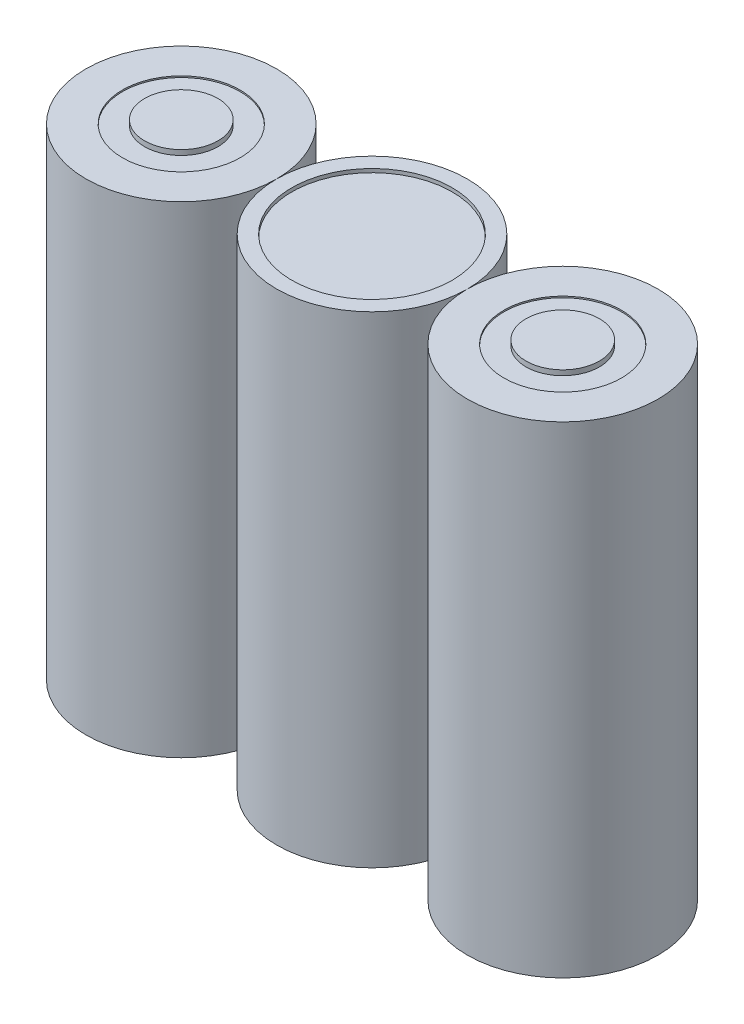
ISO-10303-21;
HEADER;
FILE_DESCRIPTION(('STEP AP214'),'2;1');
FILE_NAME('part.step','',(''),(''),'','','');
FILE_SCHEMA(('AUTOMOTIVE_DESIGN { 1 0 10303 214 1 1 1 1 }'));
ENDSEC;
DATA;
#1=APPLICATION_CONTEXT('core data for automotive mechanical design processes');
#2=APPLICATION_PROTOCOL_DEFINITION('international standard','automotive_design',2000,#1);
#3=PRODUCT_CONTEXT('',#1,'mechanical');
#4=PRODUCT('Part','Part','',(#3));
#5=PRODUCT_RELATED_PRODUCT_CATEGORY('part','',(#4));
#6=PRODUCT_DEFINITION_FORMATION('','',#4);
#7=PRODUCT_DEFINITION_CONTEXT('part definition',#1,'design');
#8=PRODUCT_DEFINITION('design','',#6,#7);
#9=PRODUCT_DEFINITION_SHAPE('','',#8);
#10=(LENGTH_UNIT() NAMED_UNIT(*) SI_UNIT(.MILLI.,.METRE.));
#11=(NAMED_UNIT(*) PLANE_ANGLE_UNIT() SI_UNIT($,.RADIAN.));
#12=(NAMED_UNIT(*) SI_UNIT($,.STERADIAN.) SOLID_ANGLE_UNIT());
#13=UNCERTAINTY_MEASURE_WITH_UNIT(LENGTH_MEASURE(1.E-05),#10,'distance_accuracy_value','');
#14=(GEOMETRIC_REPRESENTATION_CONTEXT(3) GLOBAL_UNCERTAINTY_ASSIGNED_CONTEXT((#13)) GLOBAL_UNIT_ASSIGNED_CONTEXT((#10,
#11,#12)) REPRESENTATION_CONTEXT('',''));
#15=CARTESIAN_POINT('',(0.,0.,0.));
#16=DIRECTION('',(0.,0.,1.));
#17=DIRECTION('',(1.,0.,0.));
#18=AXIS2_PLACEMENT_3D('',#15,#16,#17);
#19=CARTESIAN_POINT('',(0.,65.9,0.));
#20=DIRECTION('',(0.,-1.,0.));
#21=DIRECTION('',(0.,0.,-1.));
#22=AXIS2_PLACEMENT_3D('',#19,#20,#21);
#23=CYLINDRICAL_SURFACE('',#22,13.05);
#24=CARTESIAN_POINT('',(0.,65.9,0.));
#25=DIRECTION('',(0.,1.,0.));
#26=DIRECTION('',(0.,0.,1.));
#27=AXIS2_PLACEMENT_3D('',#24,#25,#26);
#28=CIRCLE('',#27,13.05);
#29=CARTESIAN_POINT('',(0.,65.9,13.05));
#30=VERTEX_POINT('',#29);
#31=EDGE_CURVE('P0_E10',#30,#30,#28,.T.);
#32=ORIENTED_EDGE('',*,*,#31,.F.);
#33=EDGE_LOOP('',(#32));
#34=FACE_BOUND('',#33,.T.);
#35=CARTESIAN_POINT('',(0.,0.,0.));
#36=DIRECTION('',(0.,1.,0.));
#37=DIRECTION('',(0.,0.,1.));
#38=AXIS2_PLACEMENT_3D('',#35,#36,#37);
#39=CIRCLE('',#38,13.05);
#40=CARTESIAN_POINT('',(0.,0.,13.05));
#41=VERTEX_POINT('',#40);
#42=EDGE_CURVE('P0_E18',#41,#41,#39,.T.);
#43=ORIENTED_EDGE('',*,*,#42,.T.);
#44=EDGE_LOOP('',(#43));
#45=FACE_BOUND('',#44,.T.);
#46=ADVANCED_FACE('P0_F15',(#34,#45),#23,.T.);
#47=CARTESIAN_POINT('',(0.,65.9,0.));
#48=DIRECTION('',(0.,1.,0.));
#49=DIRECTION('',(0.,0.,1.));
#50=AXIS2_PLACEMENT_3D('',#47,#48,#49);
#51=PLANE('',#50);
#52=CARTESIAN_POINT('',(0.,65.9,0.));
#53=DIRECTION('',(0.,1.,0.));
#54=DIRECTION('',(0.,0.,1.));
#55=AXIS2_PLACEMENT_3D('',#52,#53,#54);
#56=CIRCLE('',#55,8.04830878102376);
#57=CARTESIAN_POINT('',(0.,65.9,8.04830878102376));
#58=VERTEX_POINT('',#57);
#59=EDGE_CURVE('P0_E36',#58,#58,#56,.T.);
#60=ORIENTED_EDGE('',*,*,#59,.F.);
#61=EDGE_LOOP('',(#60));
#62=FACE_BOUND('',#61,.T.);
#63=ORIENTED_EDGE('',*,*,#31,.T.);
#64=EDGE_LOOP('',(#63));
#65=FACE_BOUND('',#64,.T.);
#66=ADVANCED_FACE('P0_F61',(#62,#65),#51,.T.);
#67=CARTESIAN_POINT('',(0.,0.,0.));
#68=DIRECTION('',(0.,1.,0.));
#69=DIRECTION('',(0.,0.,1.));
#70=AXIS2_PLACEMENT_3D('',#67,#68,#69);
#71=PLANE('',#70);
#72=CARTESIAN_POINT('',(0.,0.,0.));
#73=DIRECTION('',(0.,-1.,0.));
#74=DIRECTION('',(0.,0.,-1.));
#75=AXIS2_PLACEMENT_3D('',#72,#73,#74);
#76=CIRCLE('',#75,10.9781947014455);
#77=CARTESIAN_POINT('',(0.,0.,-10.9781947014455));
#78=VERTEX_POINT('',#77);
#79=EDGE_CURVE('P0_E27',#78,#78,#76,.T.);
#80=ORIENTED_EDGE('',*,*,#79,.F.);
#81=EDGE_LOOP('',(#80));
#82=FACE_BOUND('',#81,.T.);
#83=ORIENTED_EDGE('',*,*,#42,.F.);
#84=EDGE_LOOP('',(#83));
#85=FACE_BOUND('',#84,.T.);
#86=ADVANCED_FACE('P0_F63',(#82,#85),#71,.F.);
#87=CARTESIAN_POINT('',(0.,0.5,0.));
#88=DIRECTION('',(0.,-1.,0.));
#89=DIRECTION('',(0.,0.,-1.));
#90=AXIS2_PLACEMENT_3D('',#87,#88,#89);
#91=CYLINDRICAL_SURFACE('',#90,10.9781947014455);
#92=CARTESIAN_POINT('',(0.,0.5,0.));
#93=DIRECTION('',(0.,-1.,0.));
#94=DIRECTION('',(0.,0.,-1.));
#95=AXIS2_PLACEMENT_3D('',#92,#93,#94);
#96=CIRCLE('',#95,10.9781947014455);
#97=CARTESIAN_POINT('',(0.,0.5,-10.9781947014455));
#98=VERTEX_POINT('',#97);
#99=EDGE_CURVE('P0_E25',#98,#98,#96,.T.);
#100=ORIENTED_EDGE('',*,*,#99,.F.);
#101=EDGE_LOOP('',(#100));
#102=FACE_BOUND('',#101,.T.);
#103=ORIENTED_EDGE('',*,*,#79,.T.);
#104=EDGE_LOOP('',(#103));
#105=FACE_BOUND('',#104,.T.);
#106=ADVANCED_FACE('P0_F70',(#102,#105),#91,.F.);
#107=CARTESIAN_POINT('',(0.,0.5,0.));
#108=DIRECTION('',(0.,-1.,0.));
#109=DIRECTION('',(0.,0.,-1.));
#110=AXIS2_PLACEMENT_3D('',#107,#108,#109);
#111=PLANE('',#110);
#112=ORIENTED_EDGE('',*,*,#99,.T.);
#113=EDGE_LOOP('',(#112));
#114=FACE_BOUND('',#113,.T.);
#115=ADVANCED_FACE('P0_F57',(#114),#111,.T.);
#116=CARTESIAN_POINT('',(0.,65.7,0.));
#117=DIRECTION('',(0.,1.,0.));
#118=DIRECTION('',(0.,0.,1.));
#119=AXIS2_PLACEMENT_3D('',#116,#117,#118);
#120=CYLINDRICAL_SURFACE('',#119,8.04830878102376);
#121=CARTESIAN_POINT('',(0.,65.7,0.));
#122=DIRECTION('',(0.,1.,0.));
#123=DIRECTION('',(0.,0.,1.));
#124=AXIS2_PLACEMENT_3D('',#121,#122,#123);
#125=CIRCLE('',#124,8.04830878102376);
#126=CARTESIAN_POINT('',(0.,65.7,8.04830878102376));
#127=VERTEX_POINT('',#126);
#128=EDGE_CURVE('P0_E35',#127,#127,#125,.T.);
#129=ORIENTED_EDGE('',*,*,#128,.F.);
#130=EDGE_LOOP('',(#129));
#131=FACE_BOUND('',#130,.T.);
#132=ORIENTED_EDGE('',*,*,#59,.T.);
#133=EDGE_LOOP('',(#132));
#134=FACE_BOUND('',#133,.T.);
#135=ADVANCED_FACE('P0_F51',(#131,#134),#120,.F.);
#136=CARTESIAN_POINT('',(0.,65.7,0.));
#137=DIRECTION('',(0.,1.,0.));
#138=DIRECTION('',(0.,0.,1.));
#139=AXIS2_PLACEMENT_3D('',#136,#137,#138);
#140=PLANE('',#139);
#141=CARTESIAN_POINT('',(0.,65.7,0.));
#142=DIRECTION('',(0.,1.,0.));
#143=DIRECTION('',(0.,0.,1.));
#144=AXIS2_PLACEMENT_3D('',#141,#142,#143);
#145=CIRCLE('',#144,5.02170690928381);
#146=CARTESIAN_POINT('',(0.,65.7,5.02170690928381));
#147=VERTEX_POINT('',#146);
#148=EDGE_CURVE('P0_E39',#147,#147,#145,.T.);
#149=ORIENTED_EDGE('',*,*,#148,.F.);
#150=EDGE_LOOP('',(#149));
#151=FACE_BOUND('',#150,.T.);
#152=ORIENTED_EDGE('',*,*,#128,.T.);
#153=EDGE_LOOP('',(#152));
#154=FACE_BOUND('',#153,.T.);
#155=ADVANCED_FACE('P0_F47',(#151,#154),#140,.T.);
#156=CARTESIAN_POINT('',(0.,66.4,0.));
#157=DIRECTION('',(0.,1.,0.));
#158=DIRECTION('',(0.,0.,1.));
#159=AXIS2_PLACEMENT_3D('',#156,#157,#158);
#160=PLANE('',#159);
#161=CARTESIAN_POINT('',(0.,66.4,0.));
#162=DIRECTION('',(0.,1.,0.));
#163=DIRECTION('',(0.,0.,1.));
#164=AXIS2_PLACEMENT_3D('',#161,#162,#163);
#165=CIRCLE('',#164,5.02170690928381);
#166=CARTESIAN_POINT('',(0.,66.4,5.02170690928381));
#167=VERTEX_POINT('',#166);
#168=EDGE_CURVE('P0_E30',#167,#167,#165,.T.);
#169=ORIENTED_EDGE('',*,*,#168,.T.);
#170=EDGE_LOOP('',(#169));
#171=FACE_BOUND('',#170,.T.);
#172=ADVANCED_FACE('P0_F50',(#171),#160,.T.);
#173=CARTESIAN_POINT('',(0.,66.4,0.));
#174=DIRECTION('',(0.,-1.,0.));
#175=DIRECTION('',(0.,0.,-1.));
#176=AXIS2_PLACEMENT_3D('',#173,#174,#175);
#177=CYLINDRICAL_SURFACE('',#176,5.02170690928381);
#178=ORIENTED_EDGE('',*,*,#168,.F.);
#179=EDGE_LOOP('',(#178));
#180=FACE_BOUND('',#179,.T.);
#181=ORIENTED_EDGE('',*,*,#148,.T.);
#182=EDGE_LOOP('',(#181));
#183=FACE_BOUND('',#182,.T.);
#184=ADVANCED_FACE('P0_F45',(#180,#183),#177,.T.);
#185=CLOSED_SHELL('',(#46,#66,#86,#106,#115,#135,#155,#172,#184));
#186=MANIFOLD_SOLID_BREP('P0_B1',#185);
#187=CARTESIAN_POINT('',(26.1,0.,0.));
#188=DIRECTION('',(0.,1.,0.));
#189=DIRECTION('',(1.,0.,0.));
#190=AXIS2_PLACEMENT_3D('',#187,#188,#189);
#191=CYLINDRICAL_SURFACE('',#190,13.05);
#192=CARTESIAN_POINT('',(26.1,0.,0.));
#193=DIRECTION('',(0.,-1.,0.));
#194=DIRECTION('',(-1.,0.,0.));
#195=AXIS2_PLACEMENT_3D('',#192,#193,#194);
#196=CIRCLE('',#195,13.05);
#197=CARTESIAN_POINT('',(13.05,0.,0.));
#198=VERTEX_POINT('',#197);
#199=EDGE_CURVE('P1_E10',#198,#198,#196,.T.);
#200=ORIENTED_EDGE('',*,*,#199,.F.);
#201=EDGE_LOOP('',(#200));
#202=FACE_BOUND('',#201,.T.);
#203=CARTESIAN_POINT('',(26.1,65.9,0.));
#204=DIRECTION('',(0.,-1.,0.));
#205=DIRECTION('',(-1.,0.,0.));
#206=AXIS2_PLACEMENT_3D('',#203,#204,#205);
#207=CIRCLE('',#206,13.05);
#208=CARTESIAN_POINT('',(13.05,65.9,0.));
#209=VERTEX_POINT('',#208);
#210=EDGE_CURVE('P1_E18',#209,#209,#207,.T.);
#211=ORIENTED_EDGE('',*,*,#210,.T.);
#212=EDGE_LOOP('',(#211));
#213=FACE_BOUND('',#212,.T.);
#214=ADVANCED_FACE('P1_F15',(#202,#213),#191,.T.);
#215=CARTESIAN_POINT('',(26.1,0.,0.));
#216=DIRECTION('',(0.,-1.,0.));
#217=DIRECTION('',(-1.,0.,0.));
#218=AXIS2_PLACEMENT_3D('',#215,#216,#217);
#219=PLANE('',#218);
#220=CARTESIAN_POINT('',(26.1,0.,0.));
#221=DIRECTION('',(0.,-1.,0.));
#222=DIRECTION('',(-1.,0.,0.));
#223=AXIS2_PLACEMENT_3D('',#220,#221,#222);
#224=CIRCLE('',#223,8.04830878102376);
#225=CARTESIAN_POINT('',(18.0516912189762,0.,0.));
#226=VERTEX_POINT('',#225);
#227=EDGE_CURVE('P1_E36',#226,#226,#224,.T.);
#228=ORIENTED_EDGE('',*,*,#227,.F.);
#229=EDGE_LOOP('',(#228));
#230=FACE_BOUND('',#229,.T.);
#231=ORIENTED_EDGE('',*,*,#199,.T.);
#232=EDGE_LOOP('',(#231));
#233=FACE_BOUND('',#232,.T.);
#234=ADVANCED_FACE('P1_F61',(#230,#233),#219,.T.);
#235=CARTESIAN_POINT('',(26.1,65.9,0.));
#236=DIRECTION('',(0.,-1.,0.));
#237=DIRECTION('',(-1.,0.,0.));
#238=AXIS2_PLACEMENT_3D('',#235,#236,#237);
#239=PLANE('',#238);
#240=CARTESIAN_POINT('',(26.1,65.9,0.));
#241=DIRECTION('',(0.,1.,0.));
#242=DIRECTION('',(1.,0.,0.));
#243=AXIS2_PLACEMENT_3D('',#240,#241,#242);
#244=CIRCLE('',#243,10.9781947014455);
#245=CARTESIAN_POINT('',(37.0781947014455,65.9,0.));
#246=VERTEX_POINT('',#245);
#247=EDGE_CURVE('P1_E27',#246,#246,#244,.T.);
#248=ORIENTED_EDGE('',*,*,#247,.F.);
#249=EDGE_LOOP('',(#248));
#250=FACE_BOUND('',#249,.T.);
#251=ORIENTED_EDGE('',*,*,#210,.F.);
#252=EDGE_LOOP('',(#251));
#253=FACE_BOUND('',#252,.T.);
#254=ADVANCED_FACE('P1_F63',(#250,#253),#239,.F.);
#255=CARTESIAN_POINT('',(26.1,65.4,0.));
#256=DIRECTION('',(0.,1.,0.));
#257=DIRECTION('',(1.,0.,0.));
#258=AXIS2_PLACEMENT_3D('',#255,#256,#257);
#259=CYLINDRICAL_SURFACE('',#258,10.9781947014455);
#260=CARTESIAN_POINT('',(26.1,65.4,0.));
#261=DIRECTION('',(0.,1.,0.));
#262=DIRECTION('',(1.,0.,0.));
#263=AXIS2_PLACEMENT_3D('',#260,#261,#262);
#264=CIRCLE('',#263,10.9781947014455);
#265=CARTESIAN_POINT('',(37.0781947014455,65.4,0.));
#266=VERTEX_POINT('',#265);
#267=EDGE_CURVE('P1_E25',#266,#266,#264,.T.);
#268=ORIENTED_EDGE('',*,*,#267,.F.);
#269=EDGE_LOOP('',(#268));
#270=FACE_BOUND('',#269,.T.);
#271=ORIENTED_EDGE('',*,*,#247,.T.);
#272=EDGE_LOOP('',(#271));
#273=FACE_BOUND('',#272,.T.);
#274=ADVANCED_FACE('P1_F70',(#270,#273),#259,.F.);
#275=CARTESIAN_POINT('',(26.1,65.4,0.));
#276=DIRECTION('',(0.,1.,0.));
#277=DIRECTION('',(1.,0.,0.));
#278=AXIS2_PLACEMENT_3D('',#275,#276,#277);
#279=PLANE('',#278);
#280=ORIENTED_EDGE('',*,*,#267,.T.);
#281=EDGE_LOOP('',(#280));
#282=FACE_BOUND('',#281,.T.);
#283=ADVANCED_FACE('P1_F57',(#282),#279,.T.);
#284=CARTESIAN_POINT('',(26.1,0.200000000000006,0.));
#285=DIRECTION('',(0.,-1.,0.));
#286=DIRECTION('',(-1.,0.,0.));
#287=AXIS2_PLACEMENT_3D('',#284,#285,#286);
#288=CYLINDRICAL_SURFACE('',#287,8.04830878102376);
#289=CARTESIAN_POINT('',(26.1,0.200000000000006,0.));
#290=DIRECTION('',(0.,-1.,0.));
#291=DIRECTION('',(-1.,0.,0.));
#292=AXIS2_PLACEMENT_3D('',#289,#290,#291);
#293=CIRCLE('',#292,8.04830878102376);
#294=CARTESIAN_POINT('',(18.0516912189762,0.200000000000006,0.));
#295=VERTEX_POINT('',#294);
#296=EDGE_CURVE('P1_E35',#295,#295,#293,.T.);
#297=ORIENTED_EDGE('',*,*,#296,.F.);
#298=EDGE_LOOP('',(#297));
#299=FACE_BOUND('',#298,.T.);
#300=ORIENTED_EDGE('',*,*,#227,.T.);
#301=EDGE_LOOP('',(#300));
#302=FACE_BOUND('',#301,.T.);
#303=ADVANCED_FACE('P1_F51',(#299,#302),#288,.F.);
#304=CARTESIAN_POINT('',(26.1,0.200000000000006,0.));
#305=DIRECTION('',(0.,-1.,0.));
#306=DIRECTION('',(-1.,0.,0.));
#307=AXIS2_PLACEMENT_3D('',#304,#305,#306);
#308=PLANE('',#307);
#309=CARTESIAN_POINT('',(26.1,0.200000000000006,0.));
#310=DIRECTION('',(0.,-1.,0.));
#311=DIRECTION('',(-1.,0.,0.));
#312=AXIS2_PLACEMENT_3D('',#309,#310,#311);
#313=CIRCLE('',#312,5.02170690928381);
#314=CARTESIAN_POINT('',(21.0782930907162,0.200000000000006,0.));
#315=VERTEX_POINT('',#314);
#316=EDGE_CURVE('P1_E39',#315,#315,#313,.T.);
#317=ORIENTED_EDGE('',*,*,#316,.F.);
#318=EDGE_LOOP('',(#317));
#319=FACE_BOUND('',#318,.T.);
#320=ORIENTED_EDGE('',*,*,#296,.T.);
#321=EDGE_LOOP('',(#320));
#322=FACE_BOUND('',#321,.T.);
#323=ADVANCED_FACE('P1_F47',(#319,#322),#308,.T.);
#324=CARTESIAN_POINT('',(26.1,-0.5,0.));
#325=DIRECTION('',(0.,-1.,0.));
#326=DIRECTION('',(-1.,0.,0.));
#327=AXIS2_PLACEMENT_3D('',#324,#325,#326);
#328=PLANE('',#327);
#329=CARTESIAN_POINT('',(26.1,-0.5,0.));
#330=DIRECTION('',(0.,-1.,0.));
#331=DIRECTION('',(-1.,0.,0.));
#332=AXIS2_PLACEMENT_3D('',#329,#330,#331);
#333=CIRCLE('',#332,5.02170690928381);
#334=CARTESIAN_POINT('',(21.0782930907162,-0.5,0.));
#335=VERTEX_POINT('',#334);
#336=EDGE_CURVE('P1_E30',#335,#335,#333,.T.);
#337=ORIENTED_EDGE('',*,*,#336,.T.);
#338=EDGE_LOOP('',(#337));
#339=FACE_BOUND('',#338,.T.);
#340=ADVANCED_FACE('P1_F50',(#339),#328,.T.);
#341=CARTESIAN_POINT('',(26.1,-0.5,0.));
#342=DIRECTION('',(0.,1.,0.));
#343=DIRECTION('',(1.,0.,0.));
#344=AXIS2_PLACEMENT_3D('',#341,#342,#343);
#345=CYLINDRICAL_SURFACE('',#344,5.02170690928381);
#346=ORIENTED_EDGE('',*,*,#336,.F.);
#347=EDGE_LOOP('',(#346));
#348=FACE_BOUND('',#347,.T.);
#349=ORIENTED_EDGE('',*,*,#316,.T.);
#350=EDGE_LOOP('',(#349));
#351=FACE_BOUND('',#350,.T.);
#352=ADVANCED_FACE('P1_F45',(#348,#351),#345,.T.);
#353=CLOSED_SHELL('',(#214,#234,#254,#274,#283,#303,#323,#340,#352));
#354=MANIFOLD_SOLID_BREP('P1_B1',#353);
#355=CARTESIAN_POINT('',(52.2,65.9,0.));
#356=DIRECTION('',(0.,-1.,0.));
#357=DIRECTION('',(0.,0.,-1.));
#358=AXIS2_PLACEMENT_3D('',#355,#356,#357);
#359=CYLINDRICAL_SURFACE('',#358,13.05);
#360=CARTESIAN_POINT('',(52.2,65.9,0.));
#361=DIRECTION('',(0.,1.,0.));
#362=DIRECTION('',(0.,0.,1.));
#363=AXIS2_PLACEMENT_3D('',#360,#361,#362);
#364=CIRCLE('',#363,13.05);
#365=CARTESIAN_POINT('',(52.2,65.9,13.05));
#366=VERTEX_POINT('',#365);
#367=EDGE_CURVE('P2_E9',#366,#366,#364,.T.);
#368=ORIENTED_EDGE('',*,*,#367,.F.);
#369=EDGE_LOOP('',(#368));
#370=FACE_BOUND('',#369,.T.);
#371=CARTESIAN_POINT('',(52.2,0.,0.));
#372=DIRECTION('',(0.,1.,0.));
#373=DIRECTION('',(0.,0.,1.));
#374=AXIS2_PLACEMENT_3D('',#371,#372,#373);
#375=CIRCLE('',#374,13.05);
#376=CARTESIAN_POINT('',(52.2,0.,13.05));
#377=VERTEX_POINT('',#376);
#378=EDGE_CURVE('P2_E17',#377,#377,#375,.T.);
#379=ORIENTED_EDGE('',*,*,#378,.T.);
#380=EDGE_LOOP('',(#379));
#381=FACE_BOUND('',#380,.T.);
#382=ADVANCED_FACE('P2_F14',(#370,#381),#359,.T.);
#383=CARTESIAN_POINT('',(52.2,65.9,0.));
#384=DIRECTION('',(0.,1.,0.));
#385=DIRECTION('',(0.,0.,1.));
#386=AXIS2_PLACEMENT_3D('',#383,#384,#385);
#387=PLANE('',#386);
#388=CARTESIAN_POINT('',(52.2,65.9,0.));
#389=DIRECTION('',(0.,1.,0.));
#390=DIRECTION('',(0.,0.,1.));
#391=AXIS2_PLACEMENT_3D('',#388,#389,#390);
#392=CIRCLE('',#391,8.04830878102376);
#393=CARTESIAN_POINT('',(52.2,65.9,8.04830878102376));
#394=VERTEX_POINT('',#393);
#395=EDGE_CURVE('P2_E35',#394,#394,#392,.T.);
#396=ORIENTED_EDGE('',*,*,#395,.F.);
#397=EDGE_LOOP('',(#396));
#398=FACE_BOUND('',#397,.T.);
#399=ORIENTED_EDGE('',*,*,#367,.T.);
#400=EDGE_LOOP('',(#399));
#401=FACE_BOUND('',#400,.T.);
#402=ADVANCED_FACE('P2_F60',(#398,#401),#387,.T.);
#403=CARTESIAN_POINT('',(52.2,0.,0.));
#404=DIRECTION('',(0.,1.,0.));
#405=DIRECTION('',(0.,0.,1.));
#406=AXIS2_PLACEMENT_3D('',#403,#404,#405);
#407=PLANE('',#406);
#408=CARTESIAN_POINT('',(52.2,0.,0.));
#409=DIRECTION('',(0.,-1.,0.));
#410=DIRECTION('',(0.,0.,-1.));
#411=AXIS2_PLACEMENT_3D('',#408,#409,#410);
#412=CIRCLE('',#411,10.9781947014455);
#413=CARTESIAN_POINT('',(52.2,0.,-10.9781947014455));
#414=VERTEX_POINT('',#413);
#415=EDGE_CURVE('P2_E26',#414,#414,#412,.T.);
#416=ORIENTED_EDGE('',*,*,#415,.F.);
#417=EDGE_LOOP('',(#416));
#418=FACE_BOUND('',#417,.T.);
#419=ORIENTED_EDGE('',*,*,#378,.F.);
#420=EDGE_LOOP('',(#419));
#421=FACE_BOUND('',#420,.T.);
#422=ADVANCED_FACE('P2_F62',(#418,#421),#407,.F.);
#423=CARTESIAN_POINT('',(52.2,0.5,0.));
#424=DIRECTION('',(0.,-1.,0.));
#425=DIRECTION('',(0.,0.,-1.));
#426=AXIS2_PLACEMENT_3D('',#423,#424,#425);
#427=CYLINDRICAL_SURFACE('',#426,10.9781947014455);
#428=CARTESIAN_POINT('',(52.2,0.5,0.));
#429=DIRECTION('',(0.,-1.,0.));
#430=DIRECTION('',(0.,0.,-1.));
#431=AXIS2_PLACEMENT_3D('',#428,#429,#430);
#432=CIRCLE('',#431,10.9781947014455);
#433=CARTESIAN_POINT('',(52.2,0.5,-10.9781947014455));
#434=VERTEX_POINT('',#433);
#435=EDGE_CURVE('P2_E24',#434,#434,#432,.T.);
#436=ORIENTED_EDGE('',*,*,#435,.F.);
#437=EDGE_LOOP('',(#436));
#438=FACE_BOUND('',#437,.T.);
#439=ORIENTED_EDGE('',*,*,#415,.T.);
#440=EDGE_LOOP('',(#439));
#441=FACE_BOUND('',#440,.T.);
#442=ADVANCED_FACE('P2_F69',(#438,#441),#427,.F.);
#443=CARTESIAN_POINT('',(52.2,0.5,0.));
#444=DIRECTION('',(0.,-1.,0.));
#445=DIRECTION('',(0.,0.,-1.));
#446=AXIS2_PLACEMENT_3D('',#443,#444,#445);
#447=PLANE('',#446);
#448=ORIENTED_EDGE('',*,*,#435,.T.);
#449=EDGE_LOOP('',(#448));
#450=FACE_BOUND('',#449,.T.);
#451=ADVANCED_FACE('P2_F56',(#450),#447,.T.);
#452=CARTESIAN_POINT('',(52.2,65.7,0.));
#453=DIRECTION('',(0.,1.,0.));
#454=DIRECTION('',(0.,0.,1.));
#455=AXIS2_PLACEMENT_3D('',#452,#453,#454);
#456=CYLINDRICAL_SURFACE('',#455,8.04830878102376);
#457=CARTESIAN_POINT('',(52.2,65.7,0.));
#458=DIRECTION('',(0.,1.,0.));
#459=DIRECTION('',(0.,0.,1.));
#460=AXIS2_PLACEMENT_3D('',#457,#458,#459);
#461=CIRCLE('',#460,8.04830878102376);
#462=CARTESIAN_POINT('',(52.2,65.7,8.04830878102376));
#463=VERTEX_POINT('',#462);
#464=EDGE_CURVE('P2_E34',#463,#463,#461,.T.);
#465=ORIENTED_EDGE('',*,*,#464,.F.);
#466=EDGE_LOOP('',(#465));
#467=FACE_BOUND('',#466,.T.);
#468=ORIENTED_EDGE('',*,*,#395,.T.);
#469=EDGE_LOOP('',(#468));
#470=FACE_BOUND('',#469,.T.);
#471=ADVANCED_FACE('P2_F50',(#467,#470),#456,.F.);
#472=CARTESIAN_POINT('',(52.2,65.7,0.));
#473=DIRECTION('',(0.,1.,0.));
#474=DIRECTION('',(0.,0.,1.));
#475=AXIS2_PLACEMENT_3D('',#472,#473,#474);
#476=PLANE('',#475);
#477=CARTESIAN_POINT('',(52.2,65.7,0.));
#478=DIRECTION('',(0.,1.,0.));
#479=DIRECTION('',(0.,0.,1.));
#480=AXIS2_PLACEMENT_3D('',#477,#478,#479);
#481=CIRCLE('',#480,5.02170690928381);
#482=CARTESIAN_POINT('',(52.2,65.7,5.02170690928381));
#483=VERTEX_POINT('',#482);
#484=EDGE_CURVE('P2_E38',#483,#483,#481,.T.);
#485=ORIENTED_EDGE('',*,*,#484,.F.);
#486=EDGE_LOOP('',(#485));
#487=FACE_BOUND('',#486,.T.);
#488=ORIENTED_EDGE('',*,*,#464,.T.);
#489=EDGE_LOOP('',(#488));
#490=FACE_BOUND('',#489,.T.);
#491=ADVANCED_FACE('P2_F46',(#487,#490),#476,.T.);
#492=CARTESIAN_POINT('',(52.2,66.4,0.));
#493=DIRECTION('',(0.,1.,0.));
#494=DIRECTION('',(0.,0.,1.));
#495=AXIS2_PLACEMENT_3D('',#492,#493,#494);
#496=PLANE('',#495);
#497=CARTESIAN_POINT('',(52.2,66.4,0.));
#498=DIRECTION('',(0.,1.,0.));
#499=DIRECTION('',(0.,0.,1.));
#500=AXIS2_PLACEMENT_3D('',#497,#498,#499);
#501=CIRCLE('',#500,5.02170690928381);
#502=CARTESIAN_POINT('',(52.2,66.4,5.02170690928381));
#503=VERTEX_POINT('',#502);
#504=EDGE_CURVE('P2_E29',#503,#503,#501,.T.);
#505=ORIENTED_EDGE('',*,*,#504,.T.);
#506=EDGE_LOOP('',(#505));
#507=FACE_BOUND('',#506,.T.);
#508=ADVANCED_FACE('P2_F49',(#507),#496,.T.);
#509=CARTESIAN_POINT('',(52.2,66.4,0.));
#510=DIRECTION('',(0.,-1.,0.));
#511=DIRECTION('',(0.,0.,-1.));
#512=AXIS2_PLACEMENT_3D('',#509,#510,#511);
#513=CYLINDRICAL_SURFACE('',#512,5.02170690928381);
#514=ORIENTED_EDGE('',*,*,#504,.F.);
#515=EDGE_LOOP('',(#514));
#516=FACE_BOUND('',#515,.T.);
#517=ORIENTED_EDGE('',*,*,#484,.T.);
#518=EDGE_LOOP('',(#517));
#519=FACE_BOUND('',#518,.T.);
#520=ADVANCED_FACE('P2_F44',(#516,#519),#513,.T.);
#521=CLOSED_SHELL('',(#382,#402,#422,#442,#451,#471,#491,#508,#520));
#522=MANIFOLD_SOLID_BREP('P2_B1',#521);
#523=ADVANCED_BREP_SHAPE_REPRESENTATION('',(#18,#186,#354,#522),#14);
#524=SHAPE_DEFINITION_REPRESENTATION(#9,#523);
ENDSEC;
END-ISO-10303-21;
